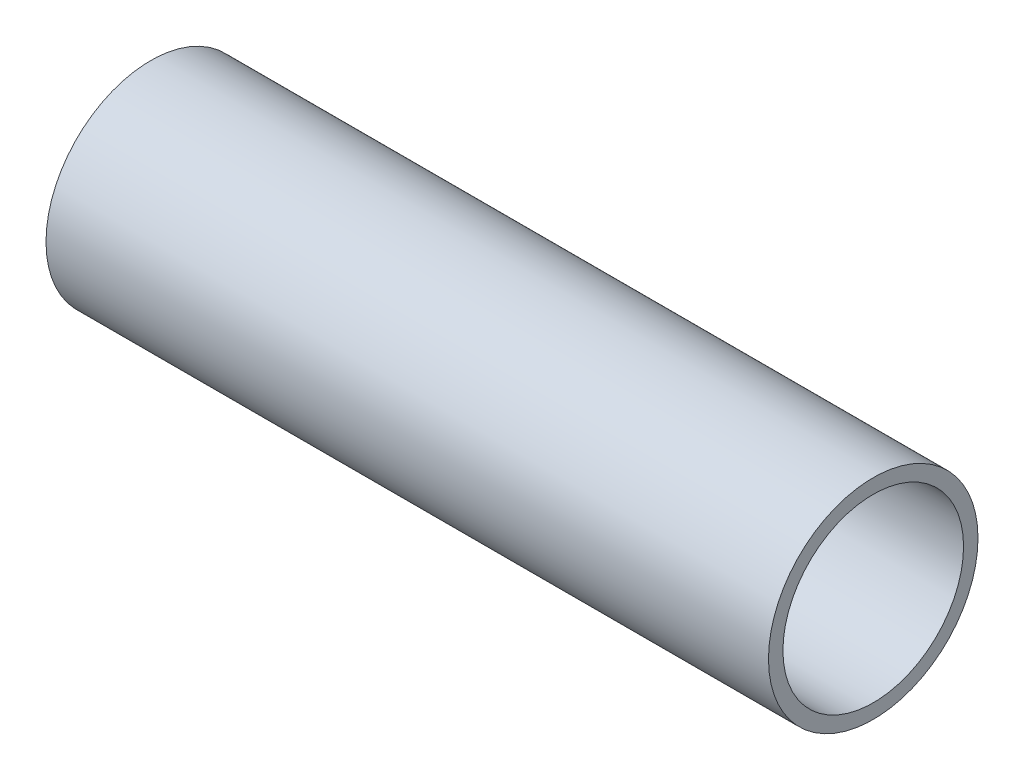
ISO-10303-21;
HEADER;
FILE_DESCRIPTION(('STEP AP214'),'2;1');
FILE_NAME('part.step','',(''),(''),'','','');
FILE_SCHEMA(('AUTOMOTIVE_DESIGN { 1 0 10303 214 1 1 1 1 }'));
ENDSEC;
DATA;
#1=APPLICATION_CONTEXT('core data for automotive mechanical design processes');
#2=APPLICATION_PROTOCOL_DEFINITION('international standard','automotive_design',2000,#1);
#3=PRODUCT_CONTEXT('',#1,'mechanical');
#4=PRODUCT('Part','Part','',(#3));
#5=PRODUCT_RELATED_PRODUCT_CATEGORY('part','',(#4));
#6=PRODUCT_DEFINITION_FORMATION('','',#4);
#7=PRODUCT_DEFINITION_CONTEXT('part definition',#1,'design');
#8=PRODUCT_DEFINITION('design','',#6,#7);
#9=PRODUCT_DEFINITION_SHAPE('','',#8);
#10=(LENGTH_UNIT() NAMED_UNIT(*) SI_UNIT(.MILLI.,.METRE.));
#11=(NAMED_UNIT(*) PLANE_ANGLE_UNIT() SI_UNIT($,.RADIAN.));
#12=(NAMED_UNIT(*) SI_UNIT($,.STERADIAN.) SOLID_ANGLE_UNIT());
#13=UNCERTAINTY_MEASURE_WITH_UNIT(LENGTH_MEASURE(1.E-05),#10,'distance_accuracy_value','');
#14=(GEOMETRIC_REPRESENTATION_CONTEXT(3) GLOBAL_UNCERTAINTY_ASSIGNED_CONTEXT((#13)) GLOBAL_UNIT_ASSIGNED_CONTEXT((#10,
#11,#12)) REPRESENTATION_CONTEXT('',''));
#15=CARTESIAN_POINT('',(0.,0.,0.));
#16=DIRECTION('',(0.,0.,1.));
#17=DIRECTION('',(1.,0.,0.));
#18=AXIS2_PLACEMENT_3D('',#15,#16,#17);
#19=CARTESIAN_POINT('',(50.0000000000001,14.5000000000001,-2.22044604925031E-13));
#20=DIRECTION('',(1.,0.,0.));
#21=DIRECTION('',(0.,0.,-1.));
#22=AXIS2_PLACEMENT_3D('',#19,#20,#21);
#23=PLANE('',#22);
#24=CARTESIAN_POINT('',(50.0000000000001,0.,-2.22044604925031E-13));
#25=DIRECTION('',(1.,0.,0.));
#26=DIRECTION('',(0.,0.,-1.));
#27=AXIS2_PLACEMENT_3D('',#24,#25,#26);
#28=CIRCLE('',#27,14.5);
#29=CARTESIAN_POINT('',(50.0000000000001,0.,-14.5000000000002));
#30=VERTEX_POINT('',#29);
#31=EDGE_CURVE('E10',#30,#30,#28,.T.);
#32=ORIENTED_EDGE('',*,*,#31,.T.);
#33=EDGE_LOOP('',(#32));
#34=FACE_BOUND('',#33,.T.);
#35=CARTESIAN_POINT('',(50.0000000000001,0.,-2.22044604925031E-13));
#36=DIRECTION('',(1.,0.,0.));
#37=DIRECTION('',(0.,0.,-1.));
#38=AXIS2_PLACEMENT_3D('',#35,#36,#37);
#39=CIRCLE('',#38,12.5);
#40=CARTESIAN_POINT('',(50.0000000000001,0.,-12.5000000000002));
#41=VERTEX_POINT('',#40);
#42=EDGE_CURVE('E42',#41,#41,#39,.T.);
#43=ORIENTED_EDGE('',*,*,#42,.F.);
#44=EDGE_LOOP('',(#43));
#45=FACE_BOUND('',#44,.T.);
#46=ADVANCED_FACE('F28',(#34,#45),#23,.T.);
#47=CARTESIAN_POINT('',(0.,0.,0.));
#48=DIRECTION('',(1.,0.,0.));
#49=DIRECTION('',(0.,0.,-1.));
#50=AXIS2_PLACEMENT_3D('',#47,#48,#49);
#51=CYLINDRICAL_SURFACE('',#50,14.5);
#52=CARTESIAN_POINT('',(-50.,0.,0.));
#53=DIRECTION('',(1.,0.,0.));
#54=DIRECTION('',(0.,0.,-1.));
#55=AXIS2_PLACEMENT_3D('',#52,#53,#54);
#56=CIRCLE('',#55,14.5);
#57=CARTESIAN_POINT('',(-50.,0.,-14.5000000000001));
#58=VERTEX_POINT('',#57);
#59=EDGE_CURVE('E34',#58,#58,#56,.T.);
#60=ORIENTED_EDGE('',*,*,#59,.T.);
#61=EDGE_LOOP('',(#60));
#62=FACE_BOUND('',#61,.T.);
#63=ORIENTED_EDGE('',*,*,#31,.F.);
#64=EDGE_LOOP('',(#63));
#65=FACE_BOUND('',#64,.T.);
#66=ADVANCED_FACE('F52',(#62,#65),#51,.T.);
#67=CARTESIAN_POINT('',(-50.,14.5,-1.66533453693773E-13));
#68=DIRECTION('',(-1.,0.,0.));
#69=DIRECTION('',(0.,0.,1.));
#70=AXIS2_PLACEMENT_3D('',#67,#68,#69);
#71=PLANE('',#70);
#72=CARTESIAN_POINT('',(-50.,0.,0.));
#73=DIRECTION('',(1.,0.,0.));
#74=DIRECTION('',(0.,0.,-1.));
#75=AXIS2_PLACEMENT_3D('',#72,#73,#74);
#76=CIRCLE('',#75,12.5);
#77=CARTESIAN_POINT('',(-50.,0.,-12.5000000000001));
#78=VERTEX_POINT('',#77);
#79=EDGE_CURVE('E38',#78,#78,#76,.T.);
#80=ORIENTED_EDGE('',*,*,#79,.T.);
#81=EDGE_LOOP('',(#80));
#82=FACE_BOUND('',#81,.T.);
#83=ORIENTED_EDGE('',*,*,#59,.F.);
#84=EDGE_LOOP('',(#83));
#85=FACE_BOUND('',#84,.T.);
#86=ADVANCED_FACE('F56',(#82,#85),#71,.T.);
#87=CARTESIAN_POINT('',(0.,0.,0.));
#88=DIRECTION('',(1.,0.,0.));
#89=DIRECTION('',(0.,0.,-1.));
#90=AXIS2_PLACEMENT_3D('',#87,#88,#89);
#91=CYLINDRICAL_SURFACE('',#90,12.5);
#92=ORIENTED_EDGE('',*,*,#42,.T.);
#93=EDGE_LOOP('',(#92));
#94=FACE_BOUND('',#93,.T.);
#95=ORIENTED_EDGE('',*,*,#79,.F.);
#96=EDGE_LOOP('',(#95));
#97=FACE_BOUND('',#96,.T.);
#98=ADVANCED_FACE('F48',(#94,#97),#91,.F.);
#99=CLOSED_SHELL('',(#46,#66,#86,#98));
#100=MANIFOLD_SOLID_BREP('B2',#99);
#101=ADVANCED_BREP_SHAPE_REPRESENTATION('',(#18,#100),#14);
#102=SHAPE_DEFINITION_REPRESENTATION(#9,#101);
ENDSEC;
END-ISO-10303-21;
